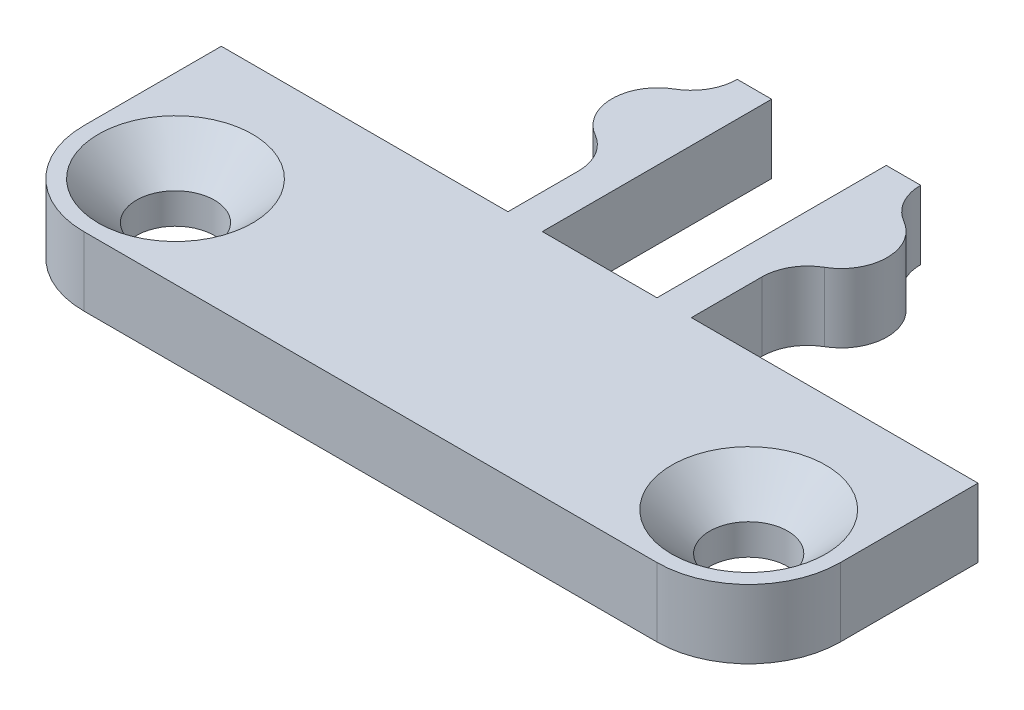
ISO-10303-21;
HEADER;
FILE_DESCRIPTION(('STEP AP214'),'2;1');
FILE_NAME('part.step','',(''),(''),'','','');
FILE_SCHEMA(('AUTOMOTIVE_DESIGN { 1 0 10303 214 1 1 1 1 }'));
ENDSEC;
DATA;
#1=APPLICATION_CONTEXT('core data for automotive mechanical design processes');
#2=APPLICATION_PROTOCOL_DEFINITION('international standard','automotive_design',2000,#1);
#3=PRODUCT_CONTEXT('',#1,'mechanical');
#4=PRODUCT('Part','Part','',(#3));
#5=PRODUCT_RELATED_PRODUCT_CATEGORY('part','',(#4));
#6=PRODUCT_DEFINITION_FORMATION('','',#4);
#7=PRODUCT_DEFINITION_CONTEXT('part definition',#1,'design');
#8=PRODUCT_DEFINITION('design','',#6,#7);
#9=PRODUCT_DEFINITION_SHAPE('','',#8);
#10=(LENGTH_UNIT() NAMED_UNIT(*) SI_UNIT(.MILLI.,.METRE.));
#11=(NAMED_UNIT(*) PLANE_ANGLE_UNIT() SI_UNIT($,.RADIAN.));
#12=(NAMED_UNIT(*) SI_UNIT($,.STERADIAN.) SOLID_ANGLE_UNIT());
#13=UNCERTAINTY_MEASURE_WITH_UNIT(LENGTH_MEASURE(1.E-05),#10,'distance_accuracy_value','');
#14=(GEOMETRIC_REPRESENTATION_CONTEXT(3) GLOBAL_UNCERTAINTY_ASSIGNED_CONTEXT((#13)) GLOBAL_UNIT_ASSIGNED_CONTEXT((#10,
#11,#12)) REPRESENTATION_CONTEXT('',''));
#15=CARTESIAN_POINT('',(0.,0.,0.));
#16=DIRECTION('',(0.,0.,1.));
#17=DIRECTION('',(1.,0.,0.));
#18=AXIS2_PLACEMENT_3D('',#15,#16,#17);
#19=CARTESIAN_POINT('',(16.5,3.,0.));
#20=DIRECTION('',(1.,0.,0.));
#21=DIRECTION('',(0.,0.,-1.));
#22=AXIS2_PLACEMENT_3D('',#19,#20,#21);
#23=PLANE('',#22);
#24=DIRECTION('',(0.,0.,1.));
#25=VECTOR('',#24,1.);
#26=CARTESIAN_POINT('',(16.5,3.,0.));
#27=LINE('',#26,#25);
#28=CARTESIAN_POINT('',(16.5,3.,0.));
#29=VERTEX_POINT('',#28);
#30=CARTESIAN_POINT('',(16.5,3.,6.));
#31=VERTEX_POINT('',#30);
#32=EDGE_CURVE('E179',#29,#31,#27,.T.);
#33=ORIENTED_EDGE('',*,*,#32,.T.);
#34=DIRECTION('',(0.,-1.,0.));
#35=VECTOR('',#34,1.);
#36=CARTESIAN_POINT('',(16.5,0.,6.));
#37=LINE('',#36,#35);
#38=CARTESIAN_POINT('',(16.5,0.,6.));
#39=VERTEX_POINT('',#38);
#40=EDGE_CURVE('E11',#31,#39,#37,.T.);
#41=ORIENTED_EDGE('',*,*,#40,.T.);
#42=DIRECTION('',(0.,0.,1.));
#43=VECTOR('',#42,1.);
#44=CARTESIAN_POINT('',(16.5,0.,0.));
#45=LINE('',#44,#43);
#46=CARTESIAN_POINT('',(16.5,0.,0.));
#47=VERTEX_POINT('',#46);
#48=EDGE_CURVE('E182',#47,#39,#45,.T.);
#49=ORIENTED_EDGE('',*,*,#48,.F.);
#50=DIRECTION('',(0.,-1.,0.));
#51=VECTOR('',#50,1.);
#52=CARTESIAN_POINT('',(16.5,3.,0.));
#53=LINE('',#52,#51);
#54=EDGE_CURVE('E178',#29,#47,#53,.T.);
#55=ORIENTED_EDGE('',*,*,#54,.F.);
#56=EDGE_LOOP('',(#33,#41,#49,#55));
#57=FACE_BOUND('',#56,.T.);
#58=ADVANCED_FACE('F38',(#57),#23,.T.);
#59=CARTESIAN_POINT('',(0.,3.,0.));
#60=DIRECTION('',(0.,0.,-1.));
#61=DIRECTION('',(-1.,0.,0.));
#62=AXIS2_PLACEMENT_3D('',#59,#60,#61);
#63=PLANE('',#62);
#64=DIRECTION('',(1.,0.,0.));
#65=VECTOR('',#64,1.);
#66=CARTESIAN_POINT('',(0.,0.,0.));
#67=LINE('',#66,#65);
#68=CARTESIAN_POINT('',(4.,0.,0.));
#69=VERTEX_POINT('',#68);
#70=EDGE_CURVE('E236',#69,#47,#67,.T.);
#71=ORIENTED_EDGE('',*,*,#70,.F.);
#72=DIRECTION('',(0.,-1.,0.));
#73=VECTOR('',#72,1.);
#74=CARTESIAN_POINT('',(4.,3.,0.));
#75=LINE('',#74,#73);
#76=CARTESIAN_POINT('',(4.,3.,0.));
#77=VERTEX_POINT('',#76);
#78=EDGE_CURVE('E188',#77,#69,#75,.T.);
#79=ORIENTED_EDGE('',*,*,#78,.F.);
#80=DIRECTION('',(1.,0.,0.));
#81=VECTOR('',#80,1.);
#82=CARTESIAN_POINT('',(0.,3.,0.));
#83=LINE('',#82,#81);
#84=EDGE_CURVE('E193',#77,#29,#83,.T.);
#85=ORIENTED_EDGE('',*,*,#84,.T.);
#86=ORIENTED_EDGE('',*,*,#54,.T.);
#87=EDGE_LOOP('',(#71,#79,#85,#86));
#88=FACE_BOUND('',#87,.T.);
#89=ADVANCED_FACE('F197',(#88),#63,.T.);
#90=CARTESIAN_POINT('',(4.,3.,0.));
#91=DIRECTION('',(1.,0.,0.));
#92=DIRECTION('',(0.,0.,-1.));
#93=AXIS2_PLACEMENT_3D('',#90,#91,#92);
#94=PLANE('',#93);
#95=DIRECTION('',(0.,0.,1.));
#96=VECTOR('',#95,1.);
#97=CARTESIAN_POINT('',(4.,0.,0.));
#98=LINE('',#97,#96);
#99=CARTESIAN_POINT('',(4.,0.,-3.07179676972449));
#100=VERTEX_POINT('',#99);
#101=EDGE_CURVE('E239',#100,#69,#98,.T.);
#102=ORIENTED_EDGE('',*,*,#101,.F.);
#103=DIRECTION('',(0.,-1.,0.));
#104=VECTOR('',#103,1.);
#105=CARTESIAN_POINT('',(4.,3.,-3.07179676972449));
#106=LINE('',#105,#104);
#107=CARTESIAN_POINT('',(4.,3.,-3.07179676972449));
#108=VERTEX_POINT('',#107);
#109=EDGE_CURVE('E306',#108,#100,#106,.T.);
#110=ORIENTED_EDGE('',*,*,#109,.F.);
#111=DIRECTION('',(0.,0.,1.));
#112=VECTOR('',#111,1.);
#113=CARTESIAN_POINT('',(4.,3.,0.));
#114=LINE('',#113,#112);
#115=EDGE_CURVE('E198',#108,#77,#114,.T.);
#116=ORIENTED_EDGE('',*,*,#115,.T.);
#117=ORIENTED_EDGE('',*,*,#78,.T.);
#118=EDGE_LOOP('',(#102,#110,#116,#117));
#119=FACE_BOUND('',#118,.T.);
#120=ADVANCED_FACE('F376',(#119),#94,.T.);
#121=CARTESIAN_POINT('',(6.,3.,-3.07179676972449));
#122=DIRECTION('',(0.,-1.,0.));
#123=DIRECTION('',(0.,0.,-1.));
#124=AXIS2_PLACEMENT_3D('',#121,#122,#123);
#125=CYLINDRICAL_SURFACE('',#124,2.);
#126=CARTESIAN_POINT('',(6.,0.,-3.07179676972449));
#127=DIRECTION('',(0.,1.,0.));
#128=DIRECTION('',(0.,0.,1.));
#129=AXIS2_PLACEMENT_3D('',#126,#127,#128);
#130=CIRCLE('',#129,2.);
#131=CARTESIAN_POINT('',(5.,0.,-4.80384757729337));
#132=VERTEX_POINT('',#131);
#133=EDGE_CURVE('E244',#132,#100,#130,.T.);
#134=ORIENTED_EDGE('',*,*,#133,.F.);
#135=DIRECTION('',(0.,-1.,0.));
#136=VECTOR('',#135,1.);
#137=CARTESIAN_POINT('',(5.,3.,-4.80384757729337));
#138=LINE('',#137,#136);
#139=CARTESIAN_POINT('',(5.,3.,-4.80384757729337));
#140=VERTEX_POINT('',#139);
#141=EDGE_CURVE('E304',#140,#132,#138,.T.);
#142=ORIENTED_EDGE('',*,*,#141,.F.);
#143=CARTESIAN_POINT('',(6.,3.,-3.07179676972449));
#144=DIRECTION('',(0.,1.,0.));
#145=DIRECTION('',(0.,0.,1.));
#146=AXIS2_PLACEMENT_3D('',#143,#144,#145);
#147=CIRCLE('',#146,2.);
#148=EDGE_CURVE('E202',#140,#108,#147,.T.);
#149=ORIENTED_EDGE('',*,*,#148,.T.);
#150=ORIENTED_EDGE('',*,*,#109,.T.);
#151=EDGE_LOOP('',(#134,#142,#149,#150));
#152=FACE_BOUND('',#151,.T.);
#153=ADVANCED_FACE('F373',(#152),#125,.F.);
#154=CARTESIAN_POINT('',(4.,3.,-6.53589838486224));
#155=DIRECTION('',(0.,-1.,0.));
#156=DIRECTION('',(0.,0.,-1.));
#157=AXIS2_PLACEMENT_3D('',#154,#155,#156);
#158=CYLINDRICAL_SURFACE('',#157,2.);
#159=CARTESIAN_POINT('',(4.,0.,-6.53589838486224));
#160=DIRECTION('',(0.,1.,0.));
#161=DIRECTION('',(0.,0.,1.));
#162=AXIS2_PLACEMENT_3D('',#159,#160,#161);
#163=CIRCLE('',#162,2.);
#164=CARTESIAN_POINT('',(5.,0.,-8.26794919243112));
#165=VERTEX_POINT('',#164);
#166=EDGE_CURVE('E247',#165,#132,#163,.F.);
#167=ORIENTED_EDGE('',*,*,#166,.F.);
#168=DIRECTION('',(0.,-1.,0.));
#169=VECTOR('',#168,1.);
#170=CARTESIAN_POINT('',(5.,3.,-8.26794919243112));
#171=LINE('',#170,#169);
#172=CARTESIAN_POINT('',(5.,3.,-8.26794919243112));
#173=VERTEX_POINT('',#172);
#174=EDGE_CURVE('E302',#173,#165,#171,.T.);
#175=ORIENTED_EDGE('',*,*,#174,.F.);
#176=CARTESIAN_POINT('',(4.,3.,-6.53589838486224));
#177=DIRECTION('',(0.,1.,0.));
#178=DIRECTION('',(0.,0.,1.));
#179=AXIS2_PLACEMENT_3D('',#176,#177,#178);
#180=CIRCLE('',#179,2.);
#181=EDGE_CURVE('E369',#173,#140,#180,.F.);
#182=ORIENTED_EDGE('',*,*,#181,.T.);
#183=ORIENTED_EDGE('',*,*,#141,.T.);
#184=EDGE_LOOP('',(#167,#175,#182,#183));
#185=FACE_BOUND('',#184,.T.);
#186=ADVANCED_FACE('F364',(#185),#158,.T.);
#187=CARTESIAN_POINT('',(6.,3.,-10.));
#188=DIRECTION('',(0.,-1.,0.));
#189=DIRECTION('',(0.,0.,-1.));
#190=AXIS2_PLACEMENT_3D('',#187,#188,#189);
#191=CYLINDRICAL_SURFACE('',#190,2.);
#192=CARTESIAN_POINT('',(6.,0.,-10.));
#193=DIRECTION('',(0.,1.,0.));
#194=DIRECTION('',(0.,0.,1.));
#195=AXIS2_PLACEMENT_3D('',#192,#193,#194);
#196=CIRCLE('',#195,2.);
#197=CARTESIAN_POINT('',(4.,0.,-10.));
#198=VERTEX_POINT('',#197);
#199=EDGE_CURVE('E250',#165,#198,#196,.F.);
#200=ORIENTED_EDGE('',*,*,#199,.T.);
#201=DIRECTION('',(0.,-1.,0.));
#202=VECTOR('',#201,1.);
#203=CARTESIAN_POINT('',(4.,3.,-10.));
#204=LINE('',#203,#202);
#205=CARTESIAN_POINT('',(4.,3.,-10.));
#206=VERTEX_POINT('',#205);
#207=EDGE_CURVE('E299',#206,#198,#204,.T.);
#208=ORIENTED_EDGE('',*,*,#207,.F.);
#209=CARTESIAN_POINT('',(6.,3.,-10.));
#210=DIRECTION('',(0.,1.,0.));
#211=DIRECTION('',(0.,0.,1.));
#212=AXIS2_PLACEMENT_3D('',#209,#210,#211);
#213=CIRCLE('',#212,2.);
#214=EDGE_CURVE('E219',#173,#206,#213,.F.);
#215=ORIENTED_EDGE('',*,*,#214,.F.);
#216=ORIENTED_EDGE('',*,*,#174,.T.);
#217=EDGE_LOOP('',(#200,#208,#215,#216));
#218=FACE_BOUND('',#217,.T.);
#219=ADVANCED_FACE('F379',(#218),#191,.F.);
#220=CARTESIAN_POINT('',(0.,3.,-10.));
#221=DIRECTION('',(0.,0.,1.));
#222=DIRECTION('',(1.,0.,0.));
#223=AXIS2_PLACEMENT_3D('',#220,#221,#222);
#224=PLANE('',#223);
#225=DIRECTION('',(-1.,0.,0.));
#226=VECTOR('',#225,1.);
#227=CARTESIAN_POINT('',(0.,0.,-10.));
#228=LINE('',#227,#226);
#229=CARTESIAN_POINT('',(2.5,0.,-10.));
#230=VERTEX_POINT('',#229);
#231=EDGE_CURVE('E252',#198,#230,#228,.T.);
#232=ORIENTED_EDGE('',*,*,#231,.T.);
#233=DIRECTION('',(0.,-1.,0.));
#234=VECTOR('',#233,1.);
#235=CARTESIAN_POINT('',(2.5,3.,-10.));
#236=LINE('',#235,#234);
#237=CARTESIAN_POINT('',(2.5,3.,-10.));
#238=VERTEX_POINT('',#237);
#239=EDGE_CURVE('E297',#238,#230,#236,.T.);
#240=ORIENTED_EDGE('',*,*,#239,.F.);
#241=DIRECTION('',(-1.,0.,0.));
#242=VECTOR('',#241,1.);
#243=CARTESIAN_POINT('',(0.,3.,-10.));
#244=LINE('',#243,#242);
#245=EDGE_CURVE('E215',#206,#238,#244,.T.);
#246=ORIENTED_EDGE('',*,*,#245,.F.);
#247=ORIENTED_EDGE('',*,*,#207,.T.);
#248=EDGE_LOOP('',(#232,#240,#246,#247));
#249=FACE_BOUND('',#248,.T.);
#250=ADVANCED_FACE('F358',(#249),#224,.F.);
#251=CARTESIAN_POINT('',(2.5,3.,0.));
#252=DIRECTION('',(-1.,0.,0.));
#253=DIRECTION('',(0.,0.,1.));
#254=AXIS2_PLACEMENT_3D('',#251,#252,#253);
#255=PLANE('',#254);
#256=DIRECTION('',(0.,0.,-1.));
#257=VECTOR('',#256,1.);
#258=CARTESIAN_POINT('',(2.5,0.,0.));
#259=LINE('',#258,#257);
#260=CARTESIAN_POINT('',(2.5,0.,0.));
#261=VERTEX_POINT('',#260);
#262=EDGE_CURVE('E255',#261,#230,#259,.T.);
#263=ORIENTED_EDGE('',*,*,#262,.F.);
#264=DIRECTION('',(0.,-1.,0.));
#265=VECTOR('',#264,1.);
#266=CARTESIAN_POINT('',(2.5,3.,0.));
#267=LINE('',#266,#265);
#268=CARTESIAN_POINT('',(2.5,3.,0.));
#269=VERTEX_POINT('',#268);
#270=EDGE_CURVE('E295',#269,#261,#267,.T.);
#271=ORIENTED_EDGE('',*,*,#270,.F.);
#272=DIRECTION('',(0.,0.,-1.));
#273=VECTOR('',#272,1.);
#274=CARTESIAN_POINT('',(2.5,3.,0.));
#275=LINE('',#274,#273);
#276=EDGE_CURVE('E209',#269,#238,#275,.T.);
#277=ORIENTED_EDGE('',*,*,#276,.T.);
#278=ORIENTED_EDGE('',*,*,#239,.T.);
#279=EDGE_LOOP('',(#263,#271,#277,#278));
#280=FACE_BOUND('',#279,.T.);
#281=ADVANCED_FACE('F354',(#280),#255,.T.);
#282=CARTESIAN_POINT('',(-2.5,0.,0.));
#283=VERTEX_POINT('',#282);
#284=EDGE_CURVE('E241',#283,#261,#67,.T.);
#285=ORIENTED_EDGE('',*,*,#284,.F.);
#286=DIRECTION('',(0.,-1.,0.));
#287=VECTOR('',#286,1.);
#288=CARTESIAN_POINT('',(-2.5,3.,0.));
#289=LINE('',#288,#287);
#290=CARTESIAN_POINT('',(-2.5,3.,0.));
#291=VERTEX_POINT('',#290);
#292=EDGE_CURVE('E293',#291,#283,#289,.T.);
#293=ORIENTED_EDGE('',*,*,#292,.F.);
#294=EDGE_CURVE('E201',#291,#269,#83,.T.);
#295=ORIENTED_EDGE('',*,*,#294,.T.);
#296=ORIENTED_EDGE('',*,*,#270,.T.);
#297=EDGE_LOOP('',(#285,#293,#295,#296));
#298=FACE_BOUND('',#297,.T.);
#299=ADVANCED_FACE('F352',(#298),#63,.T.);
#300=CARTESIAN_POINT('',(-2.5,3.,0.));
#301=DIRECTION('',(-1.,0.,0.));
#302=DIRECTION('',(0.,0.,1.));
#303=AXIS2_PLACEMENT_3D('',#300,#301,#302);
#304=PLANE('',#303);
#305=DIRECTION('',(0.,0.,-1.));
#306=VECTOR('',#305,1.);
#307=CARTESIAN_POINT('',(-2.5,0.,0.));
#308=LINE('',#307,#306);
#309=CARTESIAN_POINT('',(-2.5,0.,-10.));
#310=VERTEX_POINT('',#309);
#311=EDGE_CURVE('E258',#283,#310,#308,.T.);
#312=ORIENTED_EDGE('',*,*,#311,.T.);
#313=DIRECTION('',(0.,-1.,0.));
#314=VECTOR('',#313,1.);
#315=CARTESIAN_POINT('',(-2.5,3.,-10.));
#316=LINE('',#315,#314);
#317=CARTESIAN_POINT('',(-2.5,3.,-10.));
#318=VERTEX_POINT('',#317);
#319=EDGE_CURVE('E290',#318,#310,#316,.T.);
#320=ORIENTED_EDGE('',*,*,#319,.F.);
#321=DIRECTION('',(0.,0.,-1.));
#322=VECTOR('',#321,1.);
#323=CARTESIAN_POINT('',(-2.5,3.,0.));
#324=LINE('',#323,#322);
#325=EDGE_CURVE('E208',#291,#318,#324,.T.);
#326=ORIENTED_EDGE('',*,*,#325,.F.);
#327=ORIENTED_EDGE('',*,*,#292,.T.);
#328=EDGE_LOOP('',(#312,#320,#326,#327));
#329=FACE_BOUND('',#328,.T.);
#330=ADVANCED_FACE('F452',(#329),#304,.F.);
#331=CARTESIAN_POINT('',(0.,3.,-10.));
#332=DIRECTION('',(0.,0.,1.));
#333=DIRECTION('',(1.,0.,0.));
#334=AXIS2_PLACEMENT_3D('',#331,#332,#333);
#335=PLANE('',#334);
#336=DIRECTION('',(-1.,0.,0.));
#337=VECTOR('',#336,1.);
#338=CARTESIAN_POINT('',(0.,0.,-10.));
#339=LINE('',#338,#337);
#340=CARTESIAN_POINT('',(-4.,0.,-10.));
#341=VERTEX_POINT('',#340);
#342=EDGE_CURVE('E260',#310,#341,#339,.T.);
#343=ORIENTED_EDGE('',*,*,#342,.T.);
#344=DIRECTION('',(0.,-1.,0.));
#345=VECTOR('',#344,1.);
#346=CARTESIAN_POINT('',(-4.,3.,-10.));
#347=LINE('',#346,#345);
#348=CARTESIAN_POINT('',(-4.,3.,-10.));
#349=VERTEX_POINT('',#348);
#350=EDGE_CURVE('E287',#349,#341,#347,.T.);
#351=ORIENTED_EDGE('',*,*,#350,.F.);
#352=DIRECTION('',(-1.,0.,0.));
#353=VECTOR('',#352,1.);
#354=CARTESIAN_POINT('',(0.,3.,-10.));
#355=LINE('',#354,#353);
#356=EDGE_CURVE('E212',#318,#349,#355,.T.);
#357=ORIENTED_EDGE('',*,*,#356,.F.);
#358=ORIENTED_EDGE('',*,*,#319,.T.);
#359=EDGE_LOOP('',(#343,#351,#357,#358));
#360=FACE_BOUND('',#359,.T.);
#361=ADVANCED_FACE('F448',(#360),#335,.F.);
#362=CARTESIAN_POINT('',(-6.,3.,-10.));
#363=DIRECTION('',(0.,-1.,0.));
#364=DIRECTION('',(0.,0.,-1.));
#365=AXIS2_PLACEMENT_3D('',#362,#363,#364);
#366=CYLINDRICAL_SURFACE('',#365,2.);
#367=CARTESIAN_POINT('',(-6.,0.,-10.));
#368=DIRECTION('',(0.,1.,0.));
#369=DIRECTION('',(0.,0.,1.));
#370=AXIS2_PLACEMENT_3D('',#367,#368,#369);
#371=CIRCLE('',#370,2.);
#372=CARTESIAN_POINT('',(-5.,0.,-8.26794919243112));
#373=VERTEX_POINT('',#372);
#374=EDGE_CURVE('E262',#341,#373,#371,.F.);
#375=ORIENTED_EDGE('',*,*,#374,.T.);
#376=DIRECTION('',(0.,-1.,0.));
#377=VECTOR('',#376,1.);
#378=CARTESIAN_POINT('',(-5.,3.,-8.26794919243112));
#379=LINE('',#378,#377);
#380=CARTESIAN_POINT('',(-5.,3.,-8.26794919243112));
#381=VERTEX_POINT('',#380);
#382=EDGE_CURVE('E284',#381,#373,#379,.T.);
#383=ORIENTED_EDGE('',*,*,#382,.F.);
#384=CARTESIAN_POINT('',(-6.,3.,-10.));
#385=DIRECTION('',(0.,1.,0.));
#386=DIRECTION('',(0.,0.,1.));
#387=AXIS2_PLACEMENT_3D('',#384,#385,#386);
#388=CIRCLE('',#387,2.);
#389=EDGE_CURVE('E224',#349,#381,#388,.F.);
#390=ORIENTED_EDGE('',*,*,#389,.F.);
#391=ORIENTED_EDGE('',*,*,#350,.T.);
#392=EDGE_LOOP('',(#375,#383,#390,#391));
#393=FACE_BOUND('',#392,.T.);
#394=ADVANCED_FACE('F444',(#393),#366,.F.);
#395=CARTESIAN_POINT('',(-4.,3.,-6.53589838486224));
#396=DIRECTION('',(0.,-1.,0.));
#397=DIRECTION('',(0.,0.,-1.));
#398=AXIS2_PLACEMENT_3D('',#395,#396,#397);
#399=CYLINDRICAL_SURFACE('',#398,2.);
#400=CARTESIAN_POINT('',(-4.,0.,-6.53589838486224));
#401=DIRECTION('',(0.,1.,0.));
#402=DIRECTION('',(0.,0.,1.));
#403=AXIS2_PLACEMENT_3D('',#400,#401,#402);
#404=CIRCLE('',#403,2.);
#405=CARTESIAN_POINT('',(-5.,0.,-4.80384757729337));
#406=VERTEX_POINT('',#405);
#407=EDGE_CURVE('E264',#373,#406,#404,.T.);
#408=ORIENTED_EDGE('',*,*,#407,.T.);
#409=DIRECTION('',(0.,-1.,0.));
#410=VECTOR('',#409,1.);
#411=CARTESIAN_POINT('',(-5.,3.,-4.80384757729337));
#412=LINE('',#411,#410);
#413=CARTESIAN_POINT('',(-5.,3.,-4.80384757729337));
#414=VERTEX_POINT('',#413);
#415=EDGE_CURVE('E281',#414,#406,#412,.T.);
#416=ORIENTED_EDGE('',*,*,#415,.F.);
#417=CARTESIAN_POINT('',(-4.,3.,-6.53589838486224));
#418=DIRECTION('',(0.,1.,0.));
#419=DIRECTION('',(0.,0.,1.));
#420=AXIS2_PLACEMENT_3D('',#417,#418,#419);
#421=CIRCLE('',#420,2.);
#422=EDGE_CURVE('E226',#381,#414,#421,.T.);
#423=ORIENTED_EDGE('',*,*,#422,.F.);
#424=ORIENTED_EDGE('',*,*,#382,.T.);
#425=EDGE_LOOP('',(#408,#416,#423,#424));
#426=FACE_BOUND('',#425,.T.);
#427=ADVANCED_FACE('F440',(#426),#399,.T.);
#428=CARTESIAN_POINT('',(-6.,3.,-3.07179676972449));
#429=DIRECTION('',(0.,-1.,0.));
#430=DIRECTION('',(0.,0.,-1.));
#431=AXIS2_PLACEMENT_3D('',#428,#429,#430);
#432=CYLINDRICAL_SURFACE('',#431,2.);
#433=CARTESIAN_POINT('',(-6.,0.,-3.07179676972449));
#434=DIRECTION('',(0.,1.,0.));
#435=DIRECTION('',(0.,0.,1.));
#436=AXIS2_PLACEMENT_3D('',#433,#434,#435);
#437=CIRCLE('',#436,2.);
#438=CARTESIAN_POINT('',(-4.,0.,-3.07179676972449));
#439=VERTEX_POINT('',#438);
#440=EDGE_CURVE('E266',#406,#439,#437,.F.);
#441=ORIENTED_EDGE('',*,*,#440,.T.);
#442=DIRECTION('',(0.,-1.,0.));
#443=VECTOR('',#442,1.);
#444=CARTESIAN_POINT('',(-4.,3.,-3.07179676972449));
#445=LINE('',#444,#443);
#446=CARTESIAN_POINT('',(-4.,3.,-3.07179676972449));
#447=VERTEX_POINT('',#446);
#448=EDGE_CURVE('E278',#447,#439,#445,.T.);
#449=ORIENTED_EDGE('',*,*,#448,.F.);
#450=CARTESIAN_POINT('',(-6.,3.,-3.07179676972449));
#451=DIRECTION('',(0.,1.,0.));
#452=DIRECTION('',(0.,0.,1.));
#453=AXIS2_PLACEMENT_3D('',#450,#451,#452);
#454=CIRCLE('',#453,2.);
#455=EDGE_CURVE('E228',#414,#447,#454,.F.);
#456=ORIENTED_EDGE('',*,*,#455,.F.);
#457=ORIENTED_EDGE('',*,*,#415,.T.);
#458=EDGE_LOOP('',(#441,#449,#456,#457));
#459=FACE_BOUND('',#458,.T.);
#460=ADVANCED_FACE('F436',(#459),#432,.F.);
#461=CARTESIAN_POINT('',(-4.,3.,0.));
#462=DIRECTION('',(1.,0.,0.));
#463=DIRECTION('',(0.,0.,-1.));
#464=AXIS2_PLACEMENT_3D('',#461,#462,#463);
#465=PLANE('',#464);
#466=DIRECTION('',(0.,0.,1.));
#467=VECTOR('',#466,1.);
#468=CARTESIAN_POINT('',(-4.,0.,0.));
#469=LINE('',#468,#467);
#470=CARTESIAN_POINT('',(-4.,0.,0.));
#471=VERTEX_POINT('',#470);
#472=EDGE_CURVE('E268',#439,#471,#469,.T.);
#473=ORIENTED_EDGE('',*,*,#472,.T.);
#474=DIRECTION('',(0.,-1.,0.));
#475=VECTOR('',#474,1.);
#476=CARTESIAN_POINT('',(-4.,3.,0.));
#477=LINE('',#476,#475);
#478=CARTESIAN_POINT('',(-4.,3.,0.));
#479=VERTEX_POINT('',#478);
#480=EDGE_CURVE('E276',#479,#471,#477,.T.);
#481=ORIENTED_EDGE('',*,*,#480,.F.);
#482=DIRECTION('',(0.,0.,1.));
#483=VECTOR('',#482,1.);
#484=CARTESIAN_POINT('',(-4.,3.,0.));
#485=LINE('',#484,#483);
#486=EDGE_CURVE('E206',#447,#479,#485,.T.);
#487=ORIENTED_EDGE('',*,*,#486,.F.);
#488=ORIENTED_EDGE('',*,*,#448,.T.);
#489=EDGE_LOOP('',(#473,#481,#487,#488));
#490=FACE_BOUND('',#489,.T.);
#491=ADVANCED_FACE('F433',(#490),#465,.F.);
#492=CARTESIAN_POINT('',(-16.5,0.,0.));
#493=VERTEX_POINT('',#492);
#494=EDGE_CURVE('E240',#493,#471,#67,.T.);
#495=ORIENTED_EDGE('',*,*,#494,.F.);
#496=DIRECTION('',(0.,-1.,0.));
#497=VECTOR('',#496,1.);
#498=CARTESIAN_POINT('',(-16.5,3.,0.));
#499=LINE('',#498,#497);
#500=CARTESIAN_POINT('',(-16.5,3.,0.));
#501=VERTEX_POINT('',#500);
#502=EDGE_CURVE('E234',#501,#493,#499,.T.);
#503=ORIENTED_EDGE('',*,*,#502,.F.);
#504=EDGE_CURVE('E200',#501,#479,#83,.T.);
#505=ORIENTED_EDGE('',*,*,#504,.T.);
#506=ORIENTED_EDGE('',*,*,#480,.T.);
#507=EDGE_LOOP('',(#495,#503,#505,#506));
#508=FACE_BOUND('',#507,.T.);
#509=ADVANCED_FACE('F343',(#508),#63,.T.);
#510=CARTESIAN_POINT('',(-16.5,3.,0.));
#511=DIRECTION('',(1.,0.,0.));
#512=DIRECTION('',(0.,0.,-1.));
#513=AXIS2_PLACEMENT_3D('',#510,#511,#512);
#514=PLANE('',#513);
#515=DIRECTION('',(0.,0.,1.));
#516=VECTOR('',#515,1.);
#517=CARTESIAN_POINT('',(-16.5,0.,0.));
#518=LINE('',#517,#516);
#519=CARTESIAN_POINT('',(-16.5,0.,5.99999999999999));
#520=VERTEX_POINT('',#519);
#521=EDGE_CURVE('E271',#493,#520,#518,.T.);
#522=ORIENTED_EDGE('',*,*,#521,.T.);
#523=DIRECTION('',(0.,-1.,0.));
#524=VECTOR('',#523,1.);
#525=CARTESIAN_POINT('',(-16.5,3.,5.99999999999999));
#526=LINE('',#525,#524);
#527=CARTESIAN_POINT('',(-16.5,3.,5.99999999999999));
#528=VERTEX_POINT('',#527);
#529=EDGE_CURVE('E61',#520,#528,#526,.F.);
#530=ORIENTED_EDGE('',*,*,#529,.T.);
#531=DIRECTION('',(0.,0.,1.));
#532=VECTOR('',#531,1.);
#533=CARTESIAN_POINT('',(-16.5,3.,0.));
#534=LINE('',#533,#532);
#535=EDGE_CURVE('E205',#501,#528,#534,.T.);
#536=ORIENTED_EDGE('',*,*,#535,.F.);
#537=ORIENTED_EDGE('',*,*,#502,.T.);
#538=EDGE_LOOP('',(#522,#530,#536,#537));
#539=FACE_BOUND('',#538,.T.);
#540=ADVANCED_FACE('F341',(#539),#514,.F.);
#541=CARTESIAN_POINT('',(0.,3.,9.99999999999999));
#542=DIRECTION('',(0.,0.,-1.));
#543=DIRECTION('',(-1.,0.,0.));
#544=AXIS2_PLACEMENT_3D('',#541,#542,#543);
#545=PLANE('',#544);
#546=DIRECTION('',(1.,0.,0.));
#547=VECTOR('',#546,1.);
#548=CARTESIAN_POINT('',(0.,3.,9.99999999999999));
#549=LINE('',#548,#547);
#550=CARTESIAN_POINT('',(-12.5,3.,9.99999999999999));
#551=VERTEX_POINT('',#550);
#552=CARTESIAN_POINT('',(12.5,3.,10.));
#553=VERTEX_POINT('',#552);
#554=EDGE_CURVE('E232',#551,#553,#549,.T.);
#555=ORIENTED_EDGE('',*,*,#554,.F.);
#556=DIRECTION('',(0.,-1.,0.));
#557=VECTOR('',#556,1.);
#558=CARTESIAN_POINT('',(-12.5,3.,9.99999999999999));
#559=LINE('',#558,#557);
#560=CARTESIAN_POINT('',(-12.5,0.,9.99999999999999));
#561=VERTEX_POINT('',#560);
#562=EDGE_CURVE('E318',#551,#561,#559,.T.);
#563=ORIENTED_EDGE('',*,*,#562,.T.);
#564=DIRECTION('',(1.,0.,0.));
#565=VECTOR('',#564,1.);
#566=CARTESIAN_POINT('',(0.,0.,9.99999999999999));
#567=LINE('',#566,#565);
#568=CARTESIAN_POINT('',(12.5,0.,10.));
#569=VERTEX_POINT('',#568);
#570=EDGE_CURVE('E195',#561,#569,#567,.T.);
#571=ORIENTED_EDGE('',*,*,#570,.T.);
#572=DIRECTION('',(0.,-1.,0.));
#573=VECTOR('',#572,1.);
#574=CARTESIAN_POINT('',(12.5,3.,10.));
#575=LINE('',#574,#573);
#576=EDGE_CURVE('E187',#569,#553,#575,.F.);
#577=ORIENTED_EDGE('',*,*,#576,.T.);
#578=EDGE_LOOP('',(#555,#563,#571,#577));
#579=FACE_BOUND('',#578,.T.);
#580=ADVANCED_FACE('F332',(#579),#545,.F.);
#581=CARTESIAN_POINT('',(0.,3.,0.));
#582=DIRECTION('',(0.,1.,0.));
#583=DIRECTION('',(0.,0.,1.));
#584=AXIS2_PLACEMENT_3D('',#581,#582,#583);
#585=PLANE('',#584);
#586=CARTESIAN_POINT('',(-12.5,3.,6.));
#587=DIRECTION('',(0.,1.,0.));
#588=DIRECTION('',(0.,0.,1.));
#589=AXIS2_PLACEMENT_3D('',#586,#587,#588);
#590=CIRCLE('',#589,3.36);
#591=CARTESIAN_POINT('',(-12.5,3.,9.36));
#592=VERTEX_POINT('',#591);
#593=EDGE_CURVE('E642',#592,#592,#590,.T.);
#594=ORIENTED_EDGE('',*,*,#593,.F.);
#595=EDGE_LOOP('',(#594));
#596=FACE_BOUND('',#595,.T.);
#597=CARTESIAN_POINT('',(12.5,3.,5.99999999999999));
#598=DIRECTION('',(0.,1.,0.));
#599=DIRECTION('',(0.,0.,1.));
#600=AXIS2_PLACEMENT_3D('',#597,#598,#599);
#601=CIRCLE('',#600,3.36);
#602=CARTESIAN_POINT('',(12.5,3.,9.35999999999999));
#603=VERTEX_POINT('',#602);
#604=EDGE_CURVE('E315',#603,#603,#601,.T.);
#605=ORIENTED_EDGE('',*,*,#604,.F.);
#606=EDGE_LOOP('',(#605));
#607=FACE_BOUND('',#606,.T.);
#608=ORIENTED_EDGE('',*,*,#535,.T.);
#609=CARTESIAN_POINT('',(-12.5,3.,5.99999999999999));
#610=DIRECTION('',(0.,1.,0.));
#611=DIRECTION('',(0.,0.,1.));
#612=AXIS2_PLACEMENT_3D('',#609,#610,#611);
#613=CIRCLE('',#612,4.);
#614=EDGE_CURVE('E46',#528,#551,#613,.T.);
#615=ORIENTED_EDGE('',*,*,#614,.T.);
#616=ORIENTED_EDGE('',*,*,#554,.T.);
#617=CARTESIAN_POINT('',(12.5,3.,6.));
#618=DIRECTION('',(0.,1.,0.));
#619=DIRECTION('',(0.,0.,1.));
#620=AXIS2_PLACEMENT_3D('',#617,#618,#619);
#621=CIRCLE('',#620,4.);
#622=EDGE_CURVE('E53',#553,#31,#621,.T.);
#623=ORIENTED_EDGE('',*,*,#622,.T.);
#624=ORIENTED_EDGE('',*,*,#32,.F.);
#625=ORIENTED_EDGE('',*,*,#84,.F.);
#626=ORIENTED_EDGE('',*,*,#115,.F.);
#627=ORIENTED_EDGE('',*,*,#148,.F.);
#628=ORIENTED_EDGE('',*,*,#181,.F.);
#629=ORIENTED_EDGE('',*,*,#214,.T.);
#630=ORIENTED_EDGE('',*,*,#245,.T.);
#631=ORIENTED_EDGE('',*,*,#276,.F.);
#632=ORIENTED_EDGE('',*,*,#294,.F.);
#633=ORIENTED_EDGE('',*,*,#325,.T.);
#634=ORIENTED_EDGE('',*,*,#356,.T.);
#635=ORIENTED_EDGE('',*,*,#389,.T.);
#636=ORIENTED_EDGE('',*,*,#422,.T.);
#637=ORIENTED_EDGE('',*,*,#455,.T.);
#638=ORIENTED_EDGE('',*,*,#486,.T.);
#639=ORIENTED_EDGE('',*,*,#504,.F.);
#640=EDGE_LOOP('',(#608,#615,#616,#623,#624,#625,#626,#627,#628,#629,#630,#631,#632,#633,#634,
#635,#636,#637,#638,#639));
#641=FACE_BOUND('',#640,.T.);
#642=ADVANCED_FACE('F191',(#596,#607,#641),#585,.T.);
#643=CARTESIAN_POINT('',(0.,0.,0.));
#644=DIRECTION('',(0.,1.,0.));
#645=DIRECTION('',(0.,0.,1.));
#646=AXIS2_PLACEMENT_3D('',#643,#644,#645);
#647=PLANE('',#646);
#648=CARTESIAN_POINT('',(-12.5,0.,6.));
#649=DIRECTION('',(0.,1.,0.));
#650=DIRECTION('',(0.,0.,1.));
#651=AXIS2_PLACEMENT_3D('',#648,#649,#650);
#652=CIRCLE('',#651,1.7);
#653=CARTESIAN_POINT('',(-12.5,0.,7.69999999999999));
#654=VERTEX_POINT('',#653);
#655=EDGE_CURVE('E312',#654,#654,#652,.T.);
#656=ORIENTED_EDGE('',*,*,#655,.T.);
#657=EDGE_LOOP('',(#656));
#658=FACE_BOUND('',#657,.T.);
#659=CARTESIAN_POINT('',(12.5,0.,5.99999999999999));
#660=DIRECTION('',(0.,1.,0.));
#661=DIRECTION('',(0.,0.,1.));
#662=AXIS2_PLACEMENT_3D('',#659,#660,#661);
#663=CIRCLE('',#662,1.7);
#664=CARTESIAN_POINT('',(12.5,0.,7.69999999999999));
#665=VERTEX_POINT('',#664);
#666=EDGE_CURVE('E237',#665,#665,#663,.T.);
#667=ORIENTED_EDGE('',*,*,#666,.T.);
#668=EDGE_LOOP('',(#667));
#669=FACE_BOUND('',#668,.T.);
#670=ORIENTED_EDGE('',*,*,#570,.F.);
#671=CARTESIAN_POINT('',(-12.5,0.,5.99999999999999));
#672=DIRECTION('',(0.,1.,0.));
#673=DIRECTION('',(0.,0.,1.));
#674=AXIS2_PLACEMENT_3D('',#671,#672,#673);
#675=CIRCLE('',#674,4.);
#676=EDGE_CURVE('E323',#561,#520,#675,.F.);
#677=ORIENTED_EDGE('',*,*,#676,.T.);
#678=ORIENTED_EDGE('',*,*,#521,.F.);
#679=ORIENTED_EDGE('',*,*,#494,.T.);
#680=ORIENTED_EDGE('',*,*,#472,.F.);
#681=ORIENTED_EDGE('',*,*,#440,.F.);
#682=ORIENTED_EDGE('',*,*,#407,.F.);
#683=ORIENTED_EDGE('',*,*,#374,.F.);
#684=ORIENTED_EDGE('',*,*,#342,.F.);
#685=ORIENTED_EDGE('',*,*,#311,.F.);
#686=ORIENTED_EDGE('',*,*,#284,.T.);
#687=ORIENTED_EDGE('',*,*,#262,.T.);
#688=ORIENTED_EDGE('',*,*,#231,.F.);
#689=ORIENTED_EDGE('',*,*,#199,.F.);
#690=ORIENTED_EDGE('',*,*,#166,.T.);
#691=ORIENTED_EDGE('',*,*,#133,.T.);
#692=ORIENTED_EDGE('',*,*,#101,.T.);
#693=ORIENTED_EDGE('',*,*,#70,.T.);
#694=ORIENTED_EDGE('',*,*,#48,.T.);
#695=CARTESIAN_POINT('',(12.5,0.,6.));
#696=DIRECTION('',(0.,1.,0.));
#697=DIRECTION('',(0.,0.,1.));
#698=AXIS2_PLACEMENT_3D('',#695,#696,#697);
#699=CIRCLE('',#698,4.);
#700=EDGE_CURVE('E321',#39,#569,#699,.F.);
#701=ORIENTED_EDGE('',*,*,#700,.T.);
#702=EDGE_LOOP('',(#670,#677,#678,#679,#680,#681,#682,#683,#684,#685,#686,#687,#688,#689,#690,
#691,#692,#693,#694,#701));
#703=FACE_BOUND('',#702,.T.);
#704=ADVANCED_FACE('F338',(#658,#669,#703),#647,.F.);
#705=CARTESIAN_POINT('',(12.5,3.,5.99999999999999));
#706=DIRECTION('',(0.,1.,0.));
#707=DIRECTION('',(0.,0.,1.));
#708=AXIS2_PLACEMENT_3D('',#705,#706,#707);
#709=CYLINDRICAL_SURFACE('',#708,1.7);
#710=CARTESIAN_POINT('',(12.5,1.34,5.99999999999999));
#711=DIRECTION('',(0.,1.,0.));
#712=DIRECTION('',(0.,0.,1.));
#713=AXIS2_PLACEMENT_3D('',#710,#711,#712);
#714=CIRCLE('',#713,1.7);
#715=CARTESIAN_POINT('',(12.5,1.34,7.69999999999999));
#716=VERTEX_POINT('',#715);
#717=EDGE_CURVE('E311',#716,#716,#714,.T.);
#718=ORIENTED_EDGE('',*,*,#717,.T.);
#719=EDGE_LOOP('',(#718));
#720=FACE_BOUND('',#719,.T.);
#721=ORIENTED_EDGE('',*,*,#666,.F.);
#722=EDGE_LOOP('',(#721));
#723=FACE_BOUND('',#722,.T.);
#724=ADVANCED_FACE('F417',(#720,#723),#709,.F.);
#725=CARTESIAN_POINT('',(12.5,3.,5.99999999999999));
#726=DIRECTION('',(0.,1.,0.));
#727=DIRECTION('',(0.,0.,1.));
#728=AXIS2_PLACEMENT_3D('',#725,#726,#727);
#729=CONICAL_SURFACE('',#728,3.36,0.785398163397448);
#730=ORIENTED_EDGE('',*,*,#717,.F.);
#731=EDGE_LOOP('',(#730));
#732=FACE_BOUND('',#731,.T.);
#733=ORIENTED_EDGE('',*,*,#604,.T.);
#734=EDGE_LOOP('',(#733));
#735=FACE_BOUND('',#734,.T.);
#736=ADVANCED_FACE('F409',(#732,#735),#729,.F.);
#737=CARTESIAN_POINT('',(-12.5,3.,6.));
#738=DIRECTION('',(0.,1.,0.));
#739=DIRECTION('',(0.,0.,1.));
#740=AXIS2_PLACEMENT_3D('',#737,#738,#739);
#741=CYLINDRICAL_SURFACE('',#740,1.7);
#742=CARTESIAN_POINT('',(-12.5,1.34,6.));
#743=DIRECTION('',(0.,1.,0.));
#744=DIRECTION('',(0.,0.,1.));
#745=AXIS2_PLACEMENT_3D('',#742,#743,#744);
#746=CIRCLE('',#745,1.7);
#747=CARTESIAN_POINT('',(-12.5,1.34,7.69999999999999));
#748=VERTEX_POINT('',#747);
#749=EDGE_CURVE('E316',#748,#748,#746,.T.);
#750=ORIENTED_EDGE('',*,*,#749,.T.);
#751=EDGE_LOOP('',(#750));
#752=FACE_BOUND('',#751,.T.);
#753=ORIENTED_EDGE('',*,*,#655,.F.);
#754=EDGE_LOOP('',(#753));
#755=FACE_BOUND('',#754,.T.);
#756=ADVANCED_FACE('F403',(#752,#755),#741,.F.);
#757=CARTESIAN_POINT('',(-12.5,3.,6.));
#758=DIRECTION('',(0.,1.,0.));
#759=DIRECTION('',(0.,0.,1.));
#760=AXIS2_PLACEMENT_3D('',#757,#758,#759);
#761=CONICAL_SURFACE('',#760,3.36,0.785398163397448);
#762=ORIENTED_EDGE('',*,*,#749,.F.);
#763=EDGE_LOOP('',(#762));
#764=FACE_BOUND('',#763,.T.);
#765=ORIENTED_EDGE('',*,*,#593,.T.);
#766=EDGE_LOOP('',(#765));
#767=FACE_BOUND('',#766,.T.);
#768=ADVANCED_FACE('F397',(#764,#767),#761,.F.);
#769=CARTESIAN_POINT('',(-12.5,3.,5.99999999999999));
#770=DIRECTION('',(0.,-1.,0.));
#771=DIRECTION('',(0.,0.,-1.));
#772=AXIS2_PLACEMENT_3D('',#769,#770,#771);
#773=CYLINDRICAL_SURFACE('',#772,4.);
#774=ORIENTED_EDGE('',*,*,#614,.F.);
#775=ORIENTED_EDGE('',*,*,#529,.F.);
#776=ORIENTED_EDGE('',*,*,#676,.F.);
#777=ORIENTED_EDGE('',*,*,#562,.F.);
#778=EDGE_LOOP('',(#774,#775,#776,#777));
#779=FACE_BOUND('',#778,.T.);
#780=ADVANCED_FACE('F335',(#779),#773,.T.);
#781=CARTESIAN_POINT('',(12.5,3.,6.));
#782=DIRECTION('',(0.,1.,0.));
#783=DIRECTION('',(0.,0.,1.));
#784=AXIS2_PLACEMENT_3D('',#781,#782,#783);
#785=CYLINDRICAL_SURFACE('',#784,4.);
#786=ORIENTED_EDGE('',*,*,#622,.F.);
#787=ORIENTED_EDGE('',*,*,#576,.F.);
#788=ORIENTED_EDGE('',*,*,#700,.F.);
#789=ORIENTED_EDGE('',*,*,#40,.F.);
#790=EDGE_LOOP('',(#786,#787,#788,#789));
#791=FACE_BOUND('',#790,.T.);
#792=ADVANCED_FACE('F40',(#791),#785,.T.);
#793=CLOSED_SHELL('',(#58,#89,#120,#153,#186,#219,#250,#281,#299,#330,#361,#394,#427,#460,#491,
#509,#540,#580,#642,#704,#724,#736,#756,#768,#780,#792));
#794=MANIFOLD_SOLID_BREP('B2',#793);
#795=ADVANCED_BREP_SHAPE_REPRESENTATION('',(#18,#794),#14);
#796=SHAPE_DEFINITION_REPRESENTATION(#9,#795);
ENDSEC;
END-ISO-10303-21;
